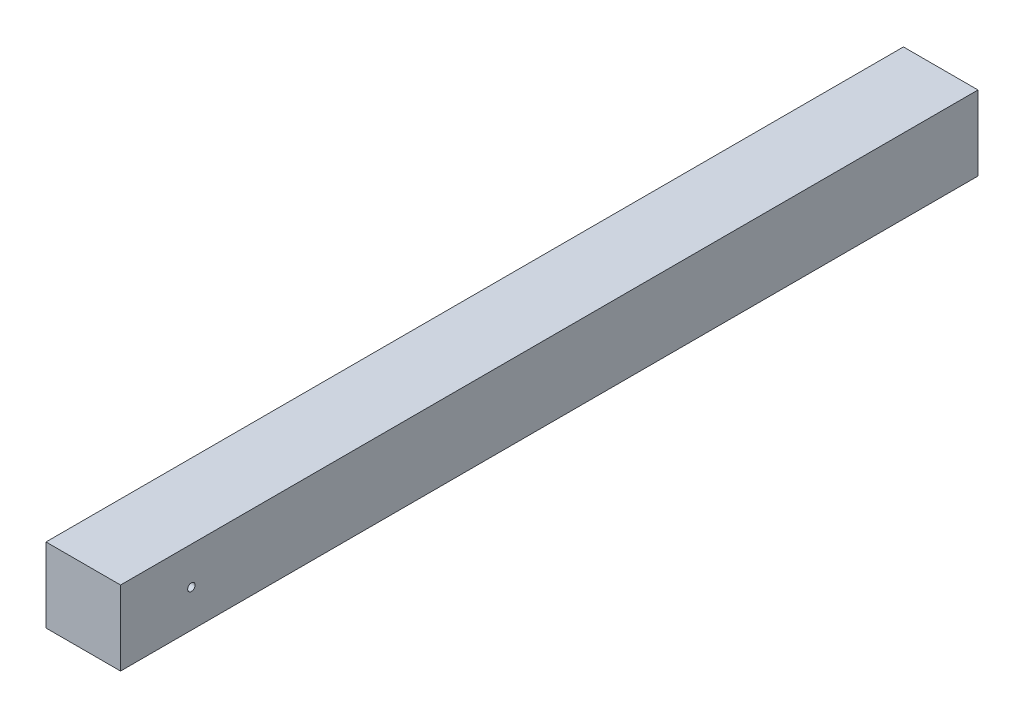
ISO-10303-21;
HEADER;
FILE_DESCRIPTION(('STEP AP214'),'2;1');
FILE_NAME('part.step','',(''),(''),'','','');
FILE_SCHEMA(('AUTOMOTIVE_DESIGN { 1 0 10303 214 1 1 1 1 }'));
ENDSEC;
DATA;
#1=APPLICATION_CONTEXT('core data for automotive mechanical design processes');
#2=APPLICATION_PROTOCOL_DEFINITION('international standard','automotive_design',2000,#1);
#3=PRODUCT_CONTEXT('',#1,'mechanical');
#4=PRODUCT('Part','Part','',(#3));
#5=PRODUCT_RELATED_PRODUCT_CATEGORY('part','',(#4));
#6=PRODUCT_DEFINITION_FORMATION('','',#4);
#7=PRODUCT_DEFINITION_CONTEXT('part definition',#1,'design');
#8=PRODUCT_DEFINITION('design','',#6,#7);
#9=PRODUCT_DEFINITION_SHAPE('','',#8);
#10=(LENGTH_UNIT() NAMED_UNIT(*) SI_UNIT(.MILLI.,.METRE.));
#11=(NAMED_UNIT(*) PLANE_ANGLE_UNIT() SI_UNIT($,.RADIAN.));
#12=(NAMED_UNIT(*) SI_UNIT($,.STERADIAN.) SOLID_ANGLE_UNIT());
#13=UNCERTAINTY_MEASURE_WITH_UNIT(LENGTH_MEASURE(1.E-05),#10,'distance_accuracy_value','');
#14=(GEOMETRIC_REPRESENTATION_CONTEXT(3) GLOBAL_UNCERTAINTY_ASSIGNED_CONTEXT((#13)) GLOBAL_UNIT_ASSIGNED_CONTEXT((#10,
#11,#12)) REPRESENTATION_CONTEXT('',''));
#15=CARTESIAN_POINT('',(0.,0.,0.));
#16=DIRECTION('',(0.,0.,1.));
#17=DIRECTION('',(1.,0.,0.));
#18=AXIS2_PLACEMENT_3D('',#15,#16,#17);
#19=CARTESIAN_POINT('',(50.,50.,575.));
#20=DIRECTION('',(-1.,0.,0.));
#21=DIRECTION('',(0.,0.,1.));
#22=AXIS2_PLACEMENT_3D('',#19,#20,#21);
#23=PLANE('',#22);
#24=CARTESIAN_POINT('',(50.,0.,480.));
#25=DIRECTION('',(1.,0.,0.));
#26=DIRECTION('',(0.,0.,-1.));
#27=AXIS2_PLACEMENT_3D('',#24,#25,#26);
#28=CIRCLE('',#27,5.00000000000005);
#29=CARTESIAN_POINT('',(50.,0.,475.));
#30=VERTEX_POINT('',#29);
#31=EDGE_CURVE('E114',#30,#30,#28,.T.);
#32=ORIENTED_EDGE('',*,*,#31,.F.);
#33=EDGE_LOOP('',(#32));
#34=FACE_BOUND('',#33,.T.);
#35=DIRECTION('',(0.,1.,0.));
#36=VECTOR('',#35,1.);
#37=CARTESIAN_POINT('',(50.,50.,-575.));
#38=LINE('',#37,#36);
#39=CARTESIAN_POINT('',(50.,-50.,-575.));
#40=VERTEX_POINT('',#39);
#41=CARTESIAN_POINT('',(50.,50.,-575.));
#42=VERTEX_POINT('',#41);
#43=EDGE_CURVE('E100',#40,#42,#38,.T.);
#44=ORIENTED_EDGE('',*,*,#43,.T.);
#45=DIRECTION('',(0.,0.,-1.));
#46=VECTOR('',#45,1.);
#47=CARTESIAN_POINT('',(50.,50.,575.));
#48=LINE('',#47,#46);
#49=CARTESIAN_POINT('',(50.,50.,575.));
#50=VERTEX_POINT('',#49);
#51=EDGE_CURVE('E11',#50,#42,#48,.T.);
#52=ORIENTED_EDGE('',*,*,#51,.F.);
#53=DIRECTION('',(0.,1.,0.));
#54=VECTOR('',#53,1.);
#55=CARTESIAN_POINT('',(50.,50.,575.));
#56=LINE('',#55,#54);
#57=CARTESIAN_POINT('',(50.,-50.,575.));
#58=VERTEX_POINT('',#57);
#59=EDGE_CURVE('E88',#58,#50,#56,.T.);
#60=ORIENTED_EDGE('',*,*,#59,.F.);
#61=DIRECTION('',(0.,0.,-1.));
#62=VECTOR('',#61,1.);
#63=CARTESIAN_POINT('',(50.,-50.,575.));
#64=LINE('',#63,#62);
#65=EDGE_CURVE('E96',#58,#40,#64,.T.);
#66=ORIENTED_EDGE('',*,*,#65,.T.);
#67=EDGE_LOOP('',(#44,#52,#60,#66));
#68=FACE_BOUND('',#67,.T.);
#69=ADVANCED_FACE('F37',(#34,#68),#23,.F.);
#70=CARTESIAN_POINT('',(-50.,50.,575.));
#71=DIRECTION('',(0.,-1.,0.));
#72=DIRECTION('',(0.,0.,-1.));
#73=AXIS2_PLACEMENT_3D('',#70,#71,#72);
#74=PLANE('',#73);
#75=DIRECTION('',(-1.,0.,0.));
#76=VECTOR('',#75,1.);
#77=CARTESIAN_POINT('',(-50.,50.,-575.));
#78=LINE('',#77,#76);
#79=CARTESIAN_POINT('',(-50.,50.,-575.));
#80=VERTEX_POINT('',#79);
#81=EDGE_CURVE('E92',#42,#80,#78,.T.);
#82=ORIENTED_EDGE('',*,*,#81,.T.);
#83=DIRECTION('',(0.,0.,-1.));
#84=VECTOR('',#83,1.);
#85=CARTESIAN_POINT('',(-50.,50.,575.));
#86=LINE('',#85,#84);
#87=CARTESIAN_POINT('',(-50.,50.,575.));
#88=VERTEX_POINT('',#87);
#89=EDGE_CURVE('E45',#88,#80,#86,.T.);
#90=ORIENTED_EDGE('',*,*,#89,.F.);
#91=DIRECTION('',(-1.,0.,0.));
#92=VECTOR('',#91,1.);
#93=CARTESIAN_POINT('',(-50.,50.,575.));
#94=LINE('',#93,#92);
#95=EDGE_CURVE('E83',#50,#88,#94,.T.);
#96=ORIENTED_EDGE('',*,*,#95,.F.);
#97=ORIENTED_EDGE('',*,*,#51,.T.);
#98=EDGE_LOOP('',(#82,#90,#96,#97));
#99=FACE_BOUND('',#98,.T.);
#100=ADVANCED_FACE('F91',(#99),#74,.F.);
#101=CARTESIAN_POINT('',(-50.,50.,575.));
#102=DIRECTION('',(1.,0.,0.));
#103=DIRECTION('',(0.,0.,-1.));
#104=AXIS2_PLACEMENT_3D('',#101,#102,#103);
#105=PLANE('',#104);
#106=CARTESIAN_POINT('',(-50.,0.,480.));
#107=DIRECTION('',(1.,0.,0.));
#108=DIRECTION('',(0.,0.,-1.));
#109=AXIS2_PLACEMENT_3D('',#106,#107,#108);
#110=CIRCLE('',#109,5.00000000000005);
#111=CARTESIAN_POINT('',(-50.,0.,475.));
#112=VERTEX_POINT('',#111);
#113=EDGE_CURVE('E103',#112,#112,#110,.T.);
#114=ORIENTED_EDGE('',*,*,#113,.T.);
#115=EDGE_LOOP('',(#114));
#116=FACE_BOUND('',#115,.T.);
#117=DIRECTION('',(0.,-1.,0.));
#118=VECTOR('',#117,1.);
#119=CARTESIAN_POINT('',(-50.,50.,-575.));
#120=LINE('',#119,#118);
#121=CARTESIAN_POINT('',(-50.,-50.,-575.));
#122=VERTEX_POINT('',#121);
#123=EDGE_CURVE('E70',#80,#122,#120,.T.);
#124=ORIENTED_EDGE('',*,*,#123,.T.);
#125=DIRECTION('',(0.,0.,-1.));
#126=VECTOR('',#125,1.);
#127=CARTESIAN_POINT('',(-50.,-50.,575.));
#128=LINE('',#127,#126);
#129=CARTESIAN_POINT('',(-50.,-50.,575.));
#130=VERTEX_POINT('',#129);
#131=EDGE_CURVE('E93',#130,#122,#128,.T.);
#132=ORIENTED_EDGE('',*,*,#131,.F.);
#133=DIRECTION('',(0.,-1.,0.));
#134=VECTOR('',#133,1.);
#135=CARTESIAN_POINT('',(-50.,50.,575.));
#136=LINE('',#135,#134);
#137=EDGE_CURVE('E86',#88,#130,#136,.T.);
#138=ORIENTED_EDGE('',*,*,#137,.F.);
#139=ORIENTED_EDGE('',*,*,#89,.T.);
#140=EDGE_LOOP('',(#124,#132,#138,#139));
#141=FACE_BOUND('',#140,.T.);
#142=ADVANCED_FACE('F94',(#116,#141),#105,.F.);
#143=CARTESIAN_POINT('',(-50.,-50.,575.));
#144=DIRECTION('',(0.,1.,0.));
#145=DIRECTION('',(0.,0.,1.));
#146=AXIS2_PLACEMENT_3D('',#143,#144,#145);
#147=PLANE('',#146);
#148=DIRECTION('',(1.,0.,0.));
#149=VECTOR('',#148,1.);
#150=CARTESIAN_POINT('',(-50.,-50.,-575.));
#151=LINE('',#150,#149);
#152=EDGE_CURVE('E76',#122,#40,#151,.T.);
#153=ORIENTED_EDGE('',*,*,#152,.T.);
#154=ORIENTED_EDGE('',*,*,#65,.F.);
#155=DIRECTION('',(1.,0.,0.));
#156=VECTOR('',#155,1.);
#157=CARTESIAN_POINT('',(-50.,-50.,575.));
#158=LINE('',#157,#156);
#159=EDGE_CURVE('E53',#130,#58,#158,.T.);
#160=ORIENTED_EDGE('',*,*,#159,.F.);
#161=ORIENTED_EDGE('',*,*,#131,.T.);
#162=EDGE_LOOP('',(#153,#154,#160,#161));
#163=FACE_BOUND('',#162,.T.);
#164=ADVANCED_FACE('F108',(#163),#147,.F.);
#165=CARTESIAN_POINT('',(0.,0.,575.));
#166=DIRECTION('',(0.,0.,1.));
#167=DIRECTION('',(1.,0.,0.));
#168=AXIS2_PLACEMENT_3D('',#165,#166,#167);
#169=PLANE('',#168);
#170=ORIENTED_EDGE('',*,*,#59,.T.);
#171=ORIENTED_EDGE('',*,*,#95,.T.);
#172=ORIENTED_EDGE('',*,*,#137,.T.);
#173=ORIENTED_EDGE('',*,*,#159,.T.);
#174=EDGE_LOOP('',(#170,#171,#172,#173));
#175=FACE_BOUND('',#174,.T.);
#176=ADVANCED_FACE('F84',(#175),#169,.T.);
#177=CARTESIAN_POINT('',(0.,0.,-575.));
#178=DIRECTION('',(0.,0.,1.));
#179=DIRECTION('',(1.,0.,0.));
#180=AXIS2_PLACEMENT_3D('',#177,#178,#179);
#181=PLANE('',#180);
#182=ORIENTED_EDGE('',*,*,#43,.F.);
#183=ORIENTED_EDGE('',*,*,#152,.F.);
#184=ORIENTED_EDGE('',*,*,#123,.F.);
#185=ORIENTED_EDGE('',*,*,#81,.F.);
#186=EDGE_LOOP('',(#182,#183,#184,#185));
#187=FACE_BOUND('',#186,.T.);
#188=ADVANCED_FACE('F111',(#187),#181,.F.);
#189=CARTESIAN_POINT('',(-50.,0.,480.));
#190=DIRECTION('',(1.,0.,0.));
#191=DIRECTION('',(0.,0.,-1.));
#192=AXIS2_PLACEMENT_3D('',#189,#190,#191);
#193=CYLINDRICAL_SURFACE('',#192,5.00000000000005);
#194=ORIENTED_EDGE('',*,*,#113,.F.);
#195=EDGE_LOOP('',(#194));
#196=FACE_BOUND('',#195,.T.);
#197=ORIENTED_EDGE('',*,*,#31,.T.);
#198=EDGE_LOOP('',(#197));
#199=FACE_BOUND('',#198,.T.);
#200=ADVANCED_FACE('F121',(#196,#199),#193,.F.);
#201=CLOSED_SHELL('',(#69,#100,#142,#164,#176,#188,#200));
#202=MANIFOLD_SOLID_BREP('B2',#201);
#203=ADVANCED_BREP_SHAPE_REPRESENTATION('',(#18,#202),#14);
#204=SHAPE_DEFINITION_REPRESENTATION(#9,#203);
ENDSEC;
END-ISO-10303-21;
